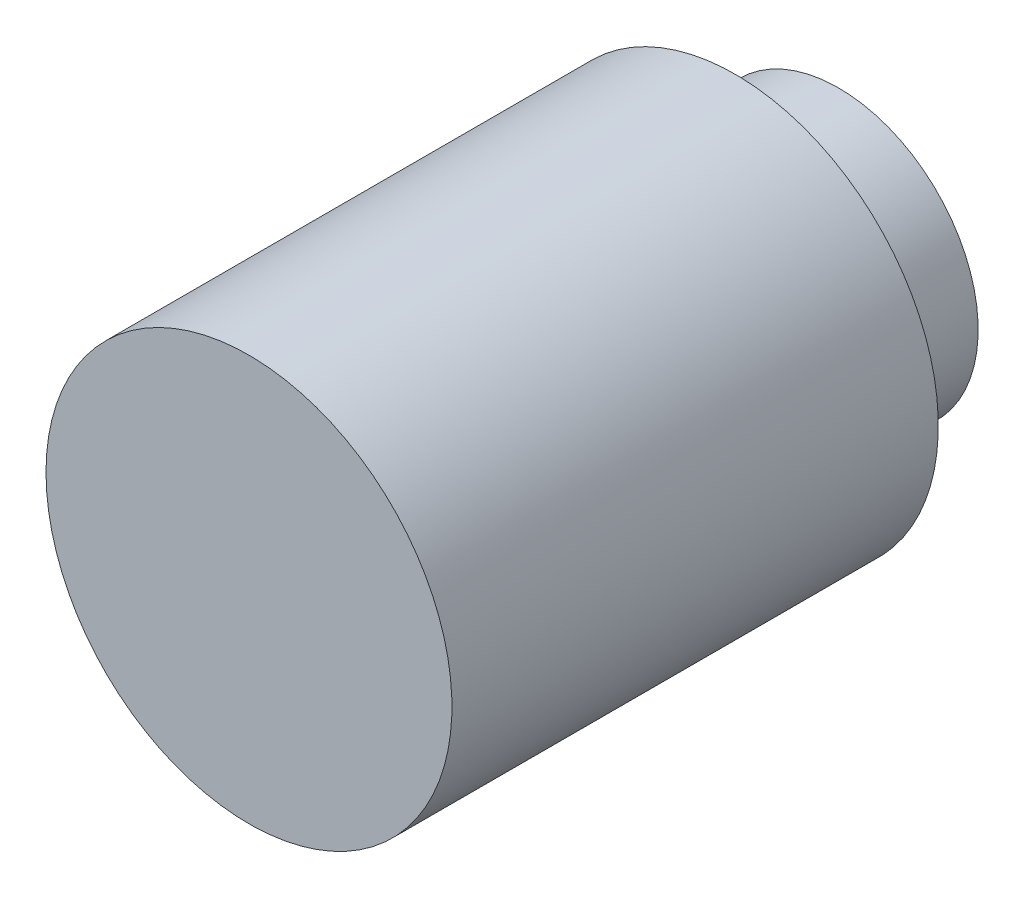
ISO-10303-21;
HEADER;
FILE_DESCRIPTION(('STEP AP214'),'2;1');
FILE_NAME('part.step','',(''),(''),'','','');
FILE_SCHEMA(('AUTOMOTIVE_DESIGN { 1 0 10303 214 1 1 1 1 }'));
ENDSEC;
DATA;
#1=APPLICATION_CONTEXT('core data for automotive mechanical design processes');
#2=APPLICATION_PROTOCOL_DEFINITION('international standard','automotive_design',2000,#1);
#3=PRODUCT_CONTEXT('',#1,'mechanical');
#4=PRODUCT('Part','Part','',(#3));
#5=PRODUCT_RELATED_PRODUCT_CATEGORY('part','',(#4));
#6=PRODUCT_DEFINITION_FORMATION('','',#4);
#7=PRODUCT_DEFINITION_CONTEXT('part definition',#1,'design');
#8=PRODUCT_DEFINITION('design','',#6,#7);
#9=PRODUCT_DEFINITION_SHAPE('','',#8);
#10=(LENGTH_UNIT() NAMED_UNIT(*) SI_UNIT(.MILLI.,.METRE.));
#11=(NAMED_UNIT(*) PLANE_ANGLE_UNIT() SI_UNIT($,.RADIAN.));
#12=(NAMED_UNIT(*) SI_UNIT($,.STERADIAN.) SOLID_ANGLE_UNIT());
#13=UNCERTAINTY_MEASURE_WITH_UNIT(LENGTH_MEASURE(1.E-05),#10,'distance_accuracy_value','');
#14=(GEOMETRIC_REPRESENTATION_CONTEXT(3) GLOBAL_UNCERTAINTY_ASSIGNED_CONTEXT((#13)) GLOBAL_UNIT_ASSIGNED_CONTEXT((#10,
#11,#12)) REPRESENTATION_CONTEXT('',''));
#15=CARTESIAN_POINT('',(0.,0.,0.));
#16=DIRECTION('',(0.,0.,1.));
#17=DIRECTION('',(1.,0.,0.));
#18=AXIS2_PLACEMENT_3D('',#15,#16,#17);
#19=CARTESIAN_POINT('',(0.,0.,0.));
#20=DIRECTION('',(0.,0.,-1.));
#21=DIRECTION('',(-1.,0.,0.));
#22=AXIS2_PLACEMENT_3D('',#19,#20,#21);
#23=PLANE('',#22);
#24=CARTESIAN_POINT('',(0.,0.,0.));
#25=DIRECTION('',(0.,0.,-1.));
#26=DIRECTION('',(-1.,0.,0.));
#27=AXIS2_PLACEMENT_3D('',#24,#25,#26);
#28=CIRCLE('',#27,6.88975);
#29=CARTESIAN_POINT('',(-6.88975,0.,0.));
#30=VERTEX_POINT('',#29);
#31=EDGE_CURVE('E10',#30,#30,#28,.T.);
#32=ORIENTED_EDGE('',*,*,#31,.F.);
#33=EDGE_LOOP('',(#32));
#34=FACE_BOUND('',#33,.T.);
#35=ADVANCED_FACE('F30',(#34),#23,.F.);
#36=CARTESIAN_POINT('',(0.,0.,-20.0152));
#37=DIRECTION('',(0.,0.,-1.));
#38=DIRECTION('',(-1.,0.,0.));
#39=AXIS2_PLACEMENT_3D('',#36,#37,#38);
#40=CYLINDRICAL_SURFACE('',#39,6.88975);
#41=CARTESIAN_POINT('',(0.,0.,-16.51));
#42=DIRECTION('',(0.,0.,-1.));
#43=DIRECTION('',(-1.,0.,0.));
#44=AXIS2_PLACEMENT_3D('',#41,#42,#43);
#45=CIRCLE('',#44,6.88975);
#46=CARTESIAN_POINT('',(-6.88975,0.,-16.51));
#47=VERTEX_POINT('',#46);
#48=EDGE_CURVE('E36',#47,#47,#45,.T.);
#49=ORIENTED_EDGE('',*,*,#48,.F.);
#50=EDGE_LOOP('',(#49));
#51=FACE_BOUND('',#50,.T.);
#52=ORIENTED_EDGE('',*,*,#31,.T.);
#53=EDGE_LOOP('',(#52));
#54=FACE_BOUND('',#53,.T.);
#55=ADVANCED_FACE('F60',(#51,#54),#40,.T.);
#56=CARTESIAN_POINT('',(6.88975,0.,-16.51));
#57=DIRECTION('',(0.,0.,1.));
#58=DIRECTION('',(1.,0.,0.));
#59=AXIS2_PLACEMENT_3D('',#56,#57,#58);
#60=PLANE('',#59);
#61=CARTESIAN_POINT('',(0.,0.,-16.51));
#62=DIRECTION('',(0.,0.,-1.));
#63=DIRECTION('',(-1.,0.,0.));
#64=AXIS2_PLACEMENT_3D('',#61,#62,#63);
#65=CIRCLE('',#64,4.7371);
#66=CARTESIAN_POINT('',(-4.7371,0.,-16.51));
#67=VERTEX_POINT('',#66);
#68=EDGE_CURVE('E40',#67,#67,#65,.T.);
#69=ORIENTED_EDGE('',*,*,#68,.F.);
#70=EDGE_LOOP('',(#69));
#71=FACE_BOUND('',#70,.T.);
#72=ORIENTED_EDGE('',*,*,#48,.T.);
#73=EDGE_LOOP('',(#72));
#74=FACE_BOUND('',#73,.T.);
#75=ADVANCED_FACE('F55',(#71,#74),#60,.F.);
#76=CARTESIAN_POINT('',(0.,0.,-20.0152));
#77=DIRECTION('',(0.,0.,-1.));
#78=DIRECTION('',(-1.,0.,0.));
#79=AXIS2_PLACEMENT_3D('',#76,#77,#78);
#80=CYLINDRICAL_SURFACE('',#79,4.7371);
#81=CARTESIAN_POINT('',(0.,0.,-20.0152));
#82=DIRECTION('',(0.,0.,-1.));
#83=DIRECTION('',(-1.,0.,0.));
#84=AXIS2_PLACEMENT_3D('',#81,#82,#83);
#85=CIRCLE('',#84,4.7371);
#86=CARTESIAN_POINT('',(-4.7371,0.,-20.0152));
#87=VERTEX_POINT('',#86);
#88=EDGE_CURVE('E44',#87,#87,#85,.T.);
#89=ORIENTED_EDGE('',*,*,#88,.F.);
#90=EDGE_LOOP('',(#89));
#91=FACE_BOUND('',#90,.T.);
#92=ORIENTED_EDGE('',*,*,#68,.T.);
#93=EDGE_LOOP('',(#92));
#94=FACE_BOUND('',#93,.T.);
#95=ADVANCED_FACE('F52',(#91,#94),#80,.T.);
#96=CARTESIAN_POINT('',(4.7371,0.,-20.0152));
#97=DIRECTION('',(0.,0.,1.));
#98=DIRECTION('',(1.,0.,0.));
#99=AXIS2_PLACEMENT_3D('',#96,#97,#98);
#100=PLANE('',#99);
#101=ORIENTED_EDGE('',*,*,#88,.T.);
#102=EDGE_LOOP('',(#101));
#103=FACE_BOUND('',#102,.T.);
#104=ADVANCED_FACE('F50',(#103),#100,.F.);
#105=CLOSED_SHELL('',(#35,#55,#75,#95,#104));
#106=MANIFOLD_SOLID_BREP('B2',#105);
#107=ADVANCED_BREP_SHAPE_REPRESENTATION('',(#18,#106),#14);
#108=SHAPE_DEFINITION_REPRESENTATION(#9,#107);
ENDSEC;
END-ISO-10303-21;
